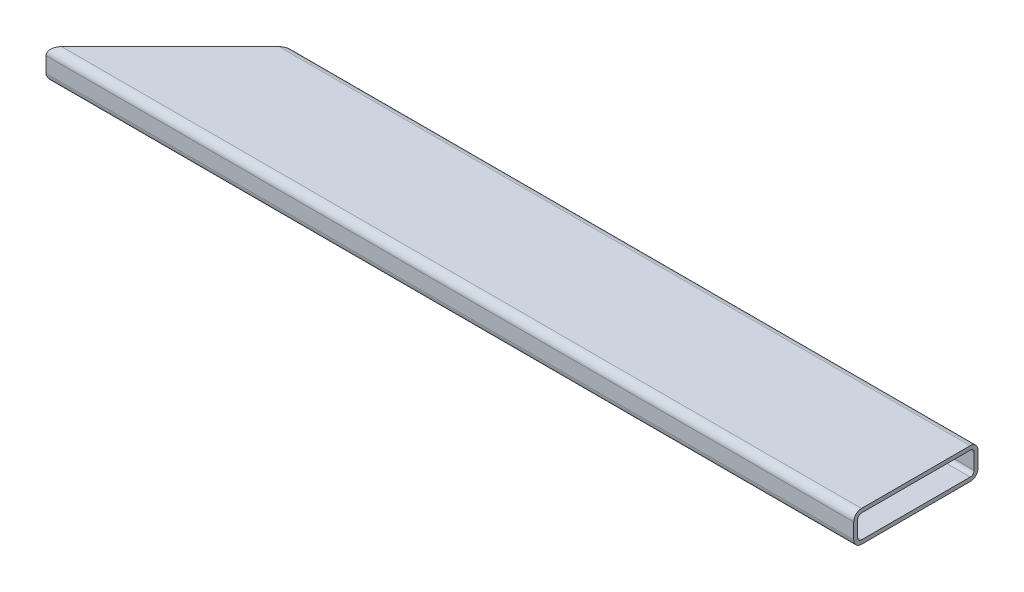
ISO-10303-21;
HEADER;
FILE_DESCRIPTION(('STEP AP214'),'2;1');
FILE_NAME('part.step','',(''),(''),'','','');
FILE_SCHEMA(('AUTOMOTIVE_DESIGN { 1 0 10303 214 1 1 1 1 }'));
ENDSEC;
DATA;
#1=APPLICATION_CONTEXT('core data for automotive mechanical design processes');
#2=APPLICATION_PROTOCOL_DEFINITION('international standard','automotive_design',2000,#1);
#3=PRODUCT_CONTEXT('',#1,'mechanical');
#4=PRODUCT('Part','Part','',(#3));
#5=PRODUCT_RELATED_PRODUCT_CATEGORY('part','',(#4));
#6=PRODUCT_DEFINITION_FORMATION('','',#4);
#7=PRODUCT_DEFINITION_CONTEXT('part definition',#1,'design');
#8=PRODUCT_DEFINITION('design','',#6,#7);
#9=PRODUCT_DEFINITION_SHAPE('','',#8);
#10=(LENGTH_UNIT() NAMED_UNIT(*) SI_UNIT(.MILLI.,.METRE.));
#11=(NAMED_UNIT(*) PLANE_ANGLE_UNIT() SI_UNIT($,.RADIAN.));
#12=(NAMED_UNIT(*) SI_UNIT($,.STERADIAN.) SOLID_ANGLE_UNIT());
#13=UNCERTAINTY_MEASURE_WITH_UNIT(LENGTH_MEASURE(1.E-05),#10,'distance_accuracy_value','');
#14=(GEOMETRIC_REPRESENTATION_CONTEXT(3) GLOBAL_UNCERTAINTY_ASSIGNED_CONTEXT((#13)) GLOBAL_UNIT_ASSIGNED_CONTEXT((#10,
#11,#12)) REPRESENTATION_CONTEXT('',''));
#15=CARTESIAN_POINT('',(0.,0.,0.));
#16=DIRECTION('',(0.,0.,1.));
#17=DIRECTION('',(1.,0.,0.));
#18=AXIS2_PLACEMENT_3D('',#15,#16,#17);
#19=CARTESIAN_POINT('',(660.4,0.,0.));
#20=DIRECTION('',(0.,0.,-1.));
#21=DIRECTION('',(-1.,0.,0.));
#22=AXIS2_PLACEMENT_3D('',#19,#20,#21);
#23=PLANE('',#22);
#24=DIRECTION('',(0.,-1.,0.));
#25=VECTOR('',#24,1.);
#26=CARTESIAN_POINT('',(0.,0.,0.));
#27=LINE('',#26,#25);
#28=CARTESIAN_POINT('',(0.,19.05,0.));
#29=VERTEX_POINT('',#28);
#30=CARTESIAN_POINT('',(0.,6.35,0.));
#31=VERTEX_POINT('',#30);
#32=EDGE_CURVE('E156',#29,#31,#27,.T.);
#33=ORIENTED_EDGE('',*,*,#32,.T.);
#34=DIRECTION('',(-1.,0.,0.));
#35=VECTOR('',#34,1.);
#36=CARTESIAN_POINT('',(660.4,6.35,0.));
#37=LINE('',#36,#35);
#38=CARTESIAN_POINT('',(660.4,6.35,0.));
#39=VERTEX_POINT('',#38);
#40=EDGE_CURVE('E46',#31,#39,#37,.F.);
#41=ORIENTED_EDGE('',*,*,#40,.T.);
#42=DIRECTION('',(0.,-1.,0.));
#43=VECTOR('',#42,1.);
#44=CARTESIAN_POINT('',(660.4,0.,0.));
#45=LINE('',#44,#43);
#46=CARTESIAN_POINT('',(660.4,19.05,0.));
#47=VERTEX_POINT('',#46);
#48=EDGE_CURVE('E188',#47,#39,#45,.T.);
#49=ORIENTED_EDGE('',*,*,#48,.F.);
#50=DIRECTION('',(-1.,0.,0.));
#51=VECTOR('',#50,1.);
#52=CARTESIAN_POINT('',(660.4,19.05,0.));
#53=LINE('',#52,#51);
#54=EDGE_CURVE('E178',#47,#29,#53,.T.);
#55=ORIENTED_EDGE('',*,*,#54,.T.);
#56=EDGE_LOOP('',(#33,#41,#49,#55));
#57=FACE_BOUND('',#56,.T.);
#58=ADVANCED_FACE('F38',(#57),#23,.F.);
#59=CARTESIAN_POINT('',(660.4,0.,0.));
#60=DIRECTION('',(0.,1.,0.));
#61=DIRECTION('',(0.,0.,1.));
#62=AXIS2_PLACEMENT_3D('',#59,#60,#61);
#63=PLANE('',#62);
#64=DIRECTION('',(-1.,0.,0.));
#65=VECTOR('',#64,1.);
#66=CARTESIAN_POINT('',(660.4,0.,-6.35));
#67=LINE('',#66,#65);
#68=CARTESIAN_POINT('',(660.4,0.,-6.35));
#69=VERTEX_POINT('',#68);
#70=CARTESIAN_POINT('',(6.35000000000008,0.,-6.35));
#71=VERTEX_POINT('',#70);
#72=EDGE_CURVE('E202',#69,#71,#67,.T.);
#73=ORIENTED_EDGE('',*,*,#72,.T.);
#74=DIRECTION('',(0.707106781186551,0.,-0.707106781186544));
#75=VECTOR('',#74,1.);
#76=CARTESIAN_POINT('',(0.,0.,0.));
#77=LINE('',#76,#75);
#78=CARTESIAN_POINT('',(95.250000000001,0.,-95.25));
#79=VERTEX_POINT('',#78);
#80=EDGE_CURVE('E172',#71,#79,#77,.T.);
#81=ORIENTED_EDGE('',*,*,#80,.T.);
#82=DIRECTION('',(-1.,0.,0.));
#83=VECTOR('',#82,1.);
#84=CARTESIAN_POINT('',(660.4,0.,-95.25));
#85=LINE('',#84,#83);
#86=CARTESIAN_POINT('',(660.4,0.,-95.25));
#87=VERTEX_POINT('',#86);
#88=EDGE_CURVE('E204',#79,#87,#85,.F.);
#89=ORIENTED_EDGE('',*,*,#88,.T.);
#90=DIRECTION('',(0.,0.,-1.));
#91=VECTOR('',#90,1.);
#92=CARTESIAN_POINT('',(660.4,0.,0.));
#93=LINE('',#92,#91);
#94=EDGE_CURVE('E197',#69,#87,#93,.T.);
#95=ORIENTED_EDGE('',*,*,#94,.F.);
#96=EDGE_LOOP('',(#73,#81,#89,#95));
#97=FACE_BOUND('',#96,.T.);
#98=ADVANCED_FACE('F284',(#97),#63,.F.);
#99=CARTESIAN_POINT('',(660.4,0.,-101.6));
#100=DIRECTION('',(0.,0.,1.));
#101=DIRECTION('',(1.,0.,0.));
#102=AXIS2_PLACEMENT_3D('',#99,#100,#101);
#103=PLANE('',#102);
#104=DIRECTION('',(-1.,0.,0.));
#105=VECTOR('',#104,1.);
#106=CARTESIAN_POINT('',(660.4,6.35,-101.6));
#107=LINE('',#106,#105);
#108=CARTESIAN_POINT('',(660.4,6.35,-101.6));
#109=VERTEX_POINT('',#108);
#110=CARTESIAN_POINT('',(101.600000000001,6.35,-101.6));
#111=VERTEX_POINT('',#110);
#112=EDGE_CURVE('E209',#109,#111,#107,.T.);
#113=ORIENTED_EDGE('',*,*,#112,.T.);
#114=DIRECTION('',(0.,1.,0.));
#115=VECTOR('',#114,1.);
#116=CARTESIAN_POINT('',(101.600000000001,0.,-101.6));
#117=LINE('',#116,#115);
#118=CARTESIAN_POINT('',(101.600000000001,19.05,-101.6));
#119=VERTEX_POINT('',#118);
#120=EDGE_CURVE('E278',#111,#119,#117,.T.);
#121=ORIENTED_EDGE('',*,*,#120,.T.);
#122=DIRECTION('',(-1.,0.,0.));
#123=VECTOR('',#122,1.);
#124=CARTESIAN_POINT('',(660.4,19.05,-101.6));
#125=LINE('',#124,#123);
#126=CARTESIAN_POINT('',(660.4,19.05,-101.6));
#127=VERTEX_POINT('',#126);
#128=EDGE_CURVE('E212',#119,#127,#125,.F.);
#129=ORIENTED_EDGE('',*,*,#128,.T.);
#130=DIRECTION('',(0.,1.,0.));
#131=VECTOR('',#130,1.);
#132=CARTESIAN_POINT('',(660.4,0.,-101.6));
#133=LINE('',#132,#131);
#134=EDGE_CURVE('E217',#109,#127,#133,.T.);
#135=ORIENTED_EDGE('',*,*,#134,.F.);
#136=EDGE_LOOP('',(#113,#121,#129,#135));
#137=FACE_BOUND('',#136,.T.);
#138=ADVANCED_FACE('F293',(#137),#103,.F.);
#139=CARTESIAN_POINT('',(660.4,25.4,0.));
#140=DIRECTION('',(0.,-1.,0.));
#141=DIRECTION('',(0.,0.,-1.));
#142=AXIS2_PLACEMENT_3D('',#139,#140,#141);
#143=PLANE('',#142);
#144=DIRECTION('',(-1.,0.,0.));
#145=VECTOR('',#144,1.);
#146=CARTESIAN_POINT('',(660.4,25.4,-95.25));
#147=LINE('',#146,#145);
#148=CARTESIAN_POINT('',(660.4,25.4,-95.25));
#149=VERTEX_POINT('',#148);
#150=CARTESIAN_POINT('',(95.250000000001,25.4,-95.25));
#151=VERTEX_POINT('',#150);
#152=EDGE_CURVE('E171',#149,#151,#147,.T.);
#153=ORIENTED_EDGE('',*,*,#152,.T.);
#154=DIRECTION('',(0.707106781186551,0.,-0.707106781186544));
#155=VECTOR('',#154,1.);
#156=CARTESIAN_POINT('',(0.,25.4,0.));
#157=LINE('',#156,#155);
#158=CARTESIAN_POINT('',(6.35000000000008,25.4,-6.35));
#159=VERTEX_POINT('',#158);
#160=EDGE_CURVE('E153',#159,#151,#157,.T.);
#161=ORIENTED_EDGE('',*,*,#160,.F.);
#162=DIRECTION('',(-1.,0.,0.));
#163=VECTOR('',#162,1.);
#164=CARTESIAN_POINT('',(660.4,25.4,-6.35));
#165=LINE('',#164,#163);
#166=CARTESIAN_POINT('',(660.4,25.4,-6.35));
#167=VERTEX_POINT('',#166);
#168=EDGE_CURVE('E168',#159,#167,#165,.F.);
#169=ORIENTED_EDGE('',*,*,#168,.T.);
#170=DIRECTION('',(0.,0.,1.));
#171=VECTOR('',#170,1.);
#172=CARTESIAN_POINT('',(660.4,25.4,0.));
#173=LINE('',#172,#171);
#174=EDGE_CURVE('E214',#149,#167,#173,.T.);
#175=ORIENTED_EDGE('',*,*,#174,.F.);
#176=EDGE_LOOP('',(#153,#161,#169,#175));
#177=FACE_BOUND('',#176,.T.);
#178=ADVANCED_FACE('F166',(#177),#143,.F.);
#179=CARTESIAN_POINT('',(660.4,0.,0.));
#180=DIRECTION('',(-1.,0.,0.));
#181=DIRECTION('',(0.,0.,1.));
#182=AXIS2_PLACEMENT_3D('',#179,#180,#181);
#183=PLANE('',#182);
#184=DIRECTION('',(0.,0.,-1.));
#185=VECTOR('',#184,1.);
#186=CARTESIAN_POINT('',(660.4,3.175,0.));
#187=LINE('',#186,#185);
#188=CARTESIAN_POINT('',(660.4,3.175,-6.35));
#189=VERTEX_POINT('',#188);
#190=CARTESIAN_POINT('',(660.4,3.175,-95.25));
#191=VERTEX_POINT('',#190);
#192=EDGE_CURVE('E235',#189,#191,#187,.T.);
#193=ORIENTED_EDGE('',*,*,#192,.F.);
#194=CARTESIAN_POINT('',(660.4,6.35,-6.35));
#195=DIRECTION('',(-1.,0.,0.));
#196=DIRECTION('',(0.,0.,1.));
#197=AXIS2_PLACEMENT_3D('',#194,#195,#196);
#198=CIRCLE('',#197,3.175);
#199=CARTESIAN_POINT('',(660.4,6.35,-3.175));
#200=VERTEX_POINT('',#199);
#201=EDGE_CURVE('E223',#200,#189,#198,.F.);
#202=ORIENTED_EDGE('',*,*,#201,.F.);
#203=DIRECTION('',(0.,-1.,0.));
#204=VECTOR('',#203,1.);
#205=CARTESIAN_POINT('',(660.4,0.,-3.175));
#206=LINE('',#205,#204);
#207=CARTESIAN_POINT('',(660.4,19.05,-3.175));
#208=VERTEX_POINT('',#207);
#209=EDGE_CURVE('E240',#208,#200,#206,.T.);
#210=ORIENTED_EDGE('',*,*,#209,.F.);
#211=CARTESIAN_POINT('',(660.4,19.05,-6.35));
#212=DIRECTION('',(-1.,0.,0.));
#213=DIRECTION('',(0.,0.,1.));
#214=AXIS2_PLACEMENT_3D('',#211,#212,#213);
#215=CIRCLE('',#214,3.175);
#216=CARTESIAN_POINT('',(660.4,22.225,-6.35));
#217=VERTEX_POINT('',#216);
#218=EDGE_CURVE('E221',#217,#208,#215,.F.);
#219=ORIENTED_EDGE('',*,*,#218,.F.);
#220=DIRECTION('',(0.,0.,1.));
#221=VECTOR('',#220,1.);
#222=CARTESIAN_POINT('',(660.4,22.225,0.));
#223=LINE('',#222,#221);
#224=CARTESIAN_POINT('',(660.4,22.225,-95.25));
#225=VERTEX_POINT('',#224);
#226=EDGE_CURVE('E225',#225,#217,#223,.T.);
#227=ORIENTED_EDGE('',*,*,#226,.F.);
#228=CARTESIAN_POINT('',(660.4,19.05,-95.25));
#229=DIRECTION('',(-1.,0.,0.));
#230=DIRECTION('',(0.,0.,1.));
#231=AXIS2_PLACEMENT_3D('',#228,#229,#230);
#232=CIRCLE('',#231,3.175);
#233=CARTESIAN_POINT('',(660.4,19.05,-98.425));
#234=VERTEX_POINT('',#233);
#235=EDGE_CURVE('E230',#234,#225,#232,.F.);
#236=ORIENTED_EDGE('',*,*,#235,.F.);
#237=DIRECTION('',(0.,1.,0.));
#238=VECTOR('',#237,1.);
#239=CARTESIAN_POINT('',(660.4,0.,-98.425));
#240=LINE('',#239,#238);
#241=CARTESIAN_POINT('',(660.4,6.35,-98.425));
#242=VERTEX_POINT('',#241);
#243=EDGE_CURVE('E229',#242,#234,#240,.T.);
#244=ORIENTED_EDGE('',*,*,#243,.F.);
#245=CARTESIAN_POINT('',(660.4,6.35,-95.25));
#246=DIRECTION('',(-1.,0.,0.));
#247=DIRECTION('',(0.,0.,1.));
#248=AXIS2_PLACEMENT_3D('',#245,#246,#247);
#249=CIRCLE('',#248,3.175);
#250=EDGE_CURVE('E232',#191,#242,#249,.F.);
#251=ORIENTED_EDGE('',*,*,#250,.F.);
#252=EDGE_LOOP('',(#193,#202,#210,#219,#227,#236,#244,#251));
#253=FACE_BOUND('',#252,.T.);
#254=ORIENTED_EDGE('',*,*,#94,.T.);
#255=CARTESIAN_POINT('',(660.4,6.35,-95.25));
#256=DIRECTION('',(-1.,0.,0.));
#257=DIRECTION('',(0.,0.,1.));
#258=AXIS2_PLACEMENT_3D('',#255,#256,#257);
#259=CIRCLE('',#258,6.35);
#260=EDGE_CURVE('E176',#87,#109,#259,.F.);
#261=ORIENTED_EDGE('',*,*,#260,.T.);
#262=ORIENTED_EDGE('',*,*,#134,.T.);
#263=CARTESIAN_POINT('',(660.4,19.05,-95.25));
#264=DIRECTION('',(-1.,0.,0.));
#265=DIRECTION('',(0.,0.,1.));
#266=AXIS2_PLACEMENT_3D('',#263,#264,#265);
#267=CIRCLE('',#266,6.35);
#268=EDGE_CURVE('E180',#127,#149,#267,.F.);
#269=ORIENTED_EDGE('',*,*,#268,.T.);
#270=ORIENTED_EDGE('',*,*,#174,.T.);
#271=CARTESIAN_POINT('',(660.4,19.05,-6.35));
#272=DIRECTION('',(-1.,0.,0.));
#273=DIRECTION('',(0.,0.,1.));
#274=AXIS2_PLACEMENT_3D('',#271,#272,#273);
#275=CIRCLE('',#274,6.35);
#276=EDGE_CURVE('E175',#167,#47,#275,.F.);
#277=ORIENTED_EDGE('',*,*,#276,.T.);
#278=ORIENTED_EDGE('',*,*,#48,.T.);
#279=CARTESIAN_POINT('',(660.4,6.35,-6.35));
#280=DIRECTION('',(-1.,0.,0.));
#281=DIRECTION('',(0.,0.,1.));
#282=AXIS2_PLACEMENT_3D('',#279,#280,#281);
#283=CIRCLE('',#282,6.35);
#284=EDGE_CURVE('E195',#39,#69,#283,.F.);
#285=ORIENTED_EDGE('',*,*,#284,.T.);
#286=EDGE_LOOP('',(#254,#261,#262,#269,#270,#277,#278,#285));
#287=FACE_BOUND('',#286,.T.);
#288=ADVANCED_FACE('F194',(#253,#287),#183,.F.);
#289=CARTESIAN_POINT('',(660.4,6.35,-95.25));
#290=DIRECTION('',(-1.,0.,0.));
#291=DIRECTION('',(0.,0.,1.));
#292=AXIS2_PLACEMENT_3D('',#289,#290,#291);
#293=CYLINDRICAL_SURFACE('',#292,6.35);
#294=CARTESIAN_POINT('',(95.2500000000011,6.35,-95.25));
#295=DIRECTION('',(0.707106781186544,0.,0.707106781186551));
#296=DIRECTION('',(-0.707106781186551,0.,0.707106781186544));
#297=AXIS2_PLACEMENT_3D('',#294,#295,#296);
#298=ELLIPSE('',#297,8.9802561210692,6.35);
#299=EDGE_CURVE('E243',#111,#79,#298,.F.);
#300=ORIENTED_EDGE('',*,*,#299,.F.);
#301=ORIENTED_EDGE('',*,*,#112,.F.);
#302=ORIENTED_EDGE('',*,*,#260,.F.);
#303=ORIENTED_EDGE('',*,*,#88,.F.);
#304=EDGE_LOOP('',(#300,#301,#302,#303));
#305=FACE_BOUND('',#304,.T.);
#306=ADVANCED_FACE('F288',(#305),#293,.T.);
#307=CARTESIAN_POINT('',(660.4,19.05,-95.25));
#308=DIRECTION('',(-1.,0.,0.));
#309=DIRECTION('',(0.,0.,1.));
#310=AXIS2_PLACEMENT_3D('',#307,#308,#309);
#311=CYLINDRICAL_SURFACE('',#310,6.35);
#312=CARTESIAN_POINT('',(95.2500000000011,19.05,-95.25));
#313=DIRECTION('',(0.707106781186544,0.,0.707106781186551));
#314=DIRECTION('',(-0.707106781186551,0.,0.707106781186544));
#315=AXIS2_PLACEMENT_3D('',#312,#313,#314);
#316=ELLIPSE('',#315,8.9802561210692,6.35);
#317=EDGE_CURVE('E261',#151,#119,#316,.F.);
#318=ORIENTED_EDGE('',*,*,#317,.F.);
#319=ORIENTED_EDGE('',*,*,#152,.F.);
#320=ORIENTED_EDGE('',*,*,#268,.F.);
#321=ORIENTED_EDGE('',*,*,#128,.F.);
#322=EDGE_LOOP('',(#318,#319,#320,#321));
#323=FACE_BOUND('',#322,.T.);
#324=ADVANCED_FACE('F296',(#323),#311,.T.);
#325=CARTESIAN_POINT('',(660.4,6.35,-6.35));
#326=DIRECTION('',(-1.,0.,0.));
#327=DIRECTION('',(0.,0.,1.));
#328=AXIS2_PLACEMENT_3D('',#325,#326,#327);
#329=CYLINDRICAL_SURFACE('',#328,6.35);
#330=CARTESIAN_POINT('',(6.35000000000008,6.35,-6.35));
#331=DIRECTION('',(0.707106781186544,0.,0.707106781186551));
#332=DIRECTION('',(-0.707106781186551,0.,0.707106781186544));
#333=AXIS2_PLACEMENT_3D('',#330,#331,#332);
#334=ELLIPSE('',#333,8.9802561210692,6.35);
#335=EDGE_CURVE('E161',#71,#31,#334,.F.);
#336=ORIENTED_EDGE('',*,*,#335,.F.);
#337=ORIENTED_EDGE('',*,*,#72,.F.);
#338=ORIENTED_EDGE('',*,*,#284,.F.);
#339=ORIENTED_EDGE('',*,*,#40,.F.);
#340=EDGE_LOOP('',(#336,#337,#338,#339));
#341=FACE_BOUND('',#340,.T.);
#342=ADVANCED_FACE('F200',(#341),#329,.T.);
#343=CARTESIAN_POINT('',(660.4,19.05,-6.35));
#344=DIRECTION('',(-1.,0.,0.));
#345=DIRECTION('',(0.,0.,1.));
#346=AXIS2_PLACEMENT_3D('',#343,#344,#345);
#347=CYLINDRICAL_SURFACE('',#346,6.35);
#348=CARTESIAN_POINT('',(6.35000000000008,19.05,-6.35));
#349=DIRECTION('',(0.707106781186544,0.,0.707106781186551));
#350=DIRECTION('',(-0.707106781186551,0.,0.707106781186544));
#351=AXIS2_PLACEMENT_3D('',#348,#349,#350);
#352=ELLIPSE('',#351,8.9802561210692,6.35);
#353=EDGE_CURVE('E150',#29,#159,#352,.F.);
#354=ORIENTED_EDGE('',*,*,#353,.F.);
#355=ORIENTED_EDGE('',*,*,#54,.F.);
#356=ORIENTED_EDGE('',*,*,#276,.F.);
#357=ORIENTED_EDGE('',*,*,#168,.F.);
#358=EDGE_LOOP('',(#354,#355,#356,#357));
#359=FACE_BOUND('',#358,.T.);
#360=ADVANCED_FACE('F40',(#359),#347,.T.);
#361=CARTESIAN_POINT('',(660.4,0.,-3.175));
#362=DIRECTION('',(0.,0.,-1.));
#363=DIRECTION('',(-1.,0.,0.));
#364=AXIS2_PLACEMENT_3D('',#361,#362,#363);
#365=PLANE('',#364);
#366=DIRECTION('',(0.,-1.,0.));
#367=VECTOR('',#366,1.);
#368=CARTESIAN_POINT('',(3.17500000000004,0.,-3.175));
#369=LINE('',#368,#367);
#370=CARTESIAN_POINT('',(3.17500000000004,19.05,-3.175));
#371=VERTEX_POINT('',#370);
#372=CARTESIAN_POINT('',(3.17500000000004,6.35,-3.175));
#373=VERTEX_POINT('',#372);
#374=EDGE_CURVE('E275',#371,#373,#369,.T.);
#375=ORIENTED_EDGE('',*,*,#374,.F.);
#376=DIRECTION('',(-1.,0.,0.));
#377=VECTOR('',#376,1.);
#378=CARTESIAN_POINT('',(660.4,19.05,-3.175));
#379=LINE('',#378,#377);
#380=EDGE_CURVE('E248',#208,#371,#379,.T.);
#381=ORIENTED_EDGE('',*,*,#380,.F.);
#382=ORIENTED_EDGE('',*,*,#209,.T.);
#383=DIRECTION('',(-1.,0.,0.));
#384=VECTOR('',#383,1.);
#385=CARTESIAN_POINT('',(660.4,6.35,-3.175));
#386=LINE('',#385,#384);
#387=EDGE_CURVE('E60',#373,#200,#386,.F.);
#388=ORIENTED_EDGE('',*,*,#387,.F.);
#389=EDGE_LOOP('',(#375,#381,#382,#388));
#390=FACE_BOUND('',#389,.T.);
#391=ADVANCED_FACE('F344',(#390),#365,.T.);
#392=CARTESIAN_POINT('',(660.4,3.175,0.));
#393=DIRECTION('',(0.,1.,0.));
#394=DIRECTION('',(0.,0.,1.));
#395=AXIS2_PLACEMENT_3D('',#392,#393,#394);
#396=PLANE('',#395);
#397=DIRECTION('',(0.707106781186551,0.,-0.707106781186544));
#398=VECTOR('',#397,1.);
#399=CARTESIAN_POINT('',(330.200000000003,3.175,-330.2));
#400=LINE('',#399,#398);
#401=CARTESIAN_POINT('',(6.35000000000008,3.175,-6.35));
#402=VERTEX_POINT('',#401);
#403=CARTESIAN_POINT('',(95.2500000000009,3.175,-95.25));
#404=VERTEX_POINT('',#403);
#405=EDGE_CURVE('E266',#402,#404,#400,.T.);
#406=ORIENTED_EDGE('',*,*,#405,.F.);
#407=DIRECTION('',(1.,0.,0.));
#408=VECTOR('',#407,1.);
#409=CARTESIAN_POINT('',(660.4,3.175,-6.35));
#410=LINE('',#409,#408);
#411=EDGE_CURVE('E253',#189,#402,#410,.F.);
#412=ORIENTED_EDGE('',*,*,#411,.F.);
#413=ORIENTED_EDGE('',*,*,#192,.T.);
#414=DIRECTION('',(1.,0.,0.));
#415=VECTOR('',#414,1.);
#416=CARTESIAN_POINT('',(660.4,3.175,-95.25));
#417=LINE('',#416,#415);
#418=EDGE_CURVE('E224',#404,#191,#417,.T.);
#419=ORIENTED_EDGE('',*,*,#418,.F.);
#420=EDGE_LOOP('',(#406,#412,#413,#419));
#421=FACE_BOUND('',#420,.T.);
#422=ADVANCED_FACE('F340',(#421),#396,.T.);
#423=CARTESIAN_POINT('',(660.4,0.,-98.425));
#424=DIRECTION('',(0.,0.,1.));
#425=DIRECTION('',(1.,0.,0.));
#426=AXIS2_PLACEMENT_3D('',#423,#424,#425);
#427=PLANE('',#426);
#428=DIRECTION('',(0.,1.,0.));
#429=VECTOR('',#428,1.);
#430=CARTESIAN_POINT('',(98.4250000000011,0.,-98.425));
#431=LINE('',#430,#429);
#432=CARTESIAN_POINT('',(98.4250000000011,6.35,-98.425));
#433=VERTEX_POINT('',#432);
#434=CARTESIAN_POINT('',(98.4250000000011,19.05,-98.425));
#435=VERTEX_POINT('',#434);
#436=EDGE_CURVE('E268',#433,#435,#431,.T.);
#437=ORIENTED_EDGE('',*,*,#436,.F.);
#438=DIRECTION('',(1.,0.,0.));
#439=VECTOR('',#438,1.);
#440=CARTESIAN_POINT('',(660.4,6.35,-98.425));
#441=LINE('',#440,#439);
#442=EDGE_CURVE('E250',#242,#433,#441,.F.);
#443=ORIENTED_EDGE('',*,*,#442,.F.);
#444=ORIENTED_EDGE('',*,*,#243,.T.);
#445=DIRECTION('',(1.,0.,0.));
#446=VECTOR('',#445,1.);
#447=CARTESIAN_POINT('',(660.4,19.05,-98.425));
#448=LINE('',#447,#446);
#449=EDGE_CURVE('E228',#435,#234,#448,.T.);
#450=ORIENTED_EDGE('',*,*,#449,.F.);
#451=EDGE_LOOP('',(#437,#443,#444,#450));
#452=FACE_BOUND('',#451,.T.);
#453=ADVANCED_FACE('F336',(#452),#427,.T.);
#454=CARTESIAN_POINT('',(660.4,22.225,0.));
#455=DIRECTION('',(0.,-1.,0.));
#456=DIRECTION('',(0.,0.,-1.));
#457=AXIS2_PLACEMENT_3D('',#454,#455,#456);
#458=PLANE('',#457);
#459=DIRECTION('',(-0.707106781186551,0.,0.707106781186544));
#460=VECTOR('',#459,1.);
#461=CARTESIAN_POINT('',(330.200000000003,22.225,-330.2));
#462=LINE('',#461,#460);
#463=CARTESIAN_POINT('',(95.2500000000009,22.225,-95.25));
#464=VERTEX_POINT('',#463);
#465=CARTESIAN_POINT('',(6.35000000000008,22.225,-6.35));
#466=VERTEX_POINT('',#465);
#467=EDGE_CURVE('E53',#464,#466,#462,.T.);
#468=ORIENTED_EDGE('',*,*,#467,.F.);
#469=DIRECTION('',(1.,0.,0.));
#470=VECTOR('',#469,1.);
#471=CARTESIAN_POINT('',(660.4,22.225,-95.25));
#472=LINE('',#471,#470);
#473=EDGE_CURVE('E245',#225,#464,#472,.F.);
#474=ORIENTED_EDGE('',*,*,#473,.F.);
#475=ORIENTED_EDGE('',*,*,#226,.T.);
#476=DIRECTION('',(1.,0.,0.));
#477=VECTOR('',#476,1.);
#478=CARTESIAN_POINT('',(660.4,22.225,-6.35));
#479=LINE('',#478,#477);
#480=EDGE_CURVE('E237',#466,#217,#479,.T.);
#481=ORIENTED_EDGE('',*,*,#480,.F.);
#482=EDGE_LOOP('',(#468,#474,#475,#481));
#483=FACE_BOUND('',#482,.T.);
#484=ADVANCED_FACE('F332',(#483),#458,.T.);
#485=CARTESIAN_POINT('',(660.4,6.35,-95.25));
#486=DIRECTION('',(-1.,0.,0.));
#487=DIRECTION('',(0.,0.,1.));
#488=AXIS2_PLACEMENT_3D('',#485,#486,#487);
#489=CYLINDRICAL_SURFACE('',#488,3.175);
#490=ORIENTED_EDGE('',*,*,#442,.T.);
#491=CARTESIAN_POINT('',(95.2500000000011,6.35,-95.25));
#492=DIRECTION('',(0.707106781186544,0.,0.707106781186551));
#493=DIRECTION('',(-0.707106781186551,0.,0.707106781186544));
#494=AXIS2_PLACEMENT_3D('',#491,#492,#493);
#495=ELLIPSE('',#494,4.4901280605346,3.175);
#496=EDGE_CURVE('E162',#433,#404,#495,.F.);
#497=ORIENTED_EDGE('',*,*,#496,.T.);
#498=ORIENTED_EDGE('',*,*,#418,.T.);
#499=ORIENTED_EDGE('',*,*,#250,.T.);
#500=EDGE_LOOP('',(#490,#497,#498,#499));
#501=FACE_BOUND('',#500,.T.);
#502=ADVANCED_FACE('F328',(#501),#489,.F.);
#503=CARTESIAN_POINT('',(660.4,19.05,-95.25));
#504=DIRECTION('',(-1.,0.,0.));
#505=DIRECTION('',(0.,0.,1.));
#506=AXIS2_PLACEMENT_3D('',#503,#504,#505);
#507=CYLINDRICAL_SURFACE('',#506,3.175);
#508=ORIENTED_EDGE('',*,*,#473,.T.);
#509=CARTESIAN_POINT('',(95.2500000000011,19.05,-95.25));
#510=DIRECTION('',(0.707106781186544,0.,0.707106781186551));
#511=DIRECTION('',(-0.707106781186551,0.,0.707106781186544));
#512=AXIS2_PLACEMENT_3D('',#509,#510,#511);
#513=ELLIPSE('',#512,4.4901280605346,3.175);
#514=EDGE_CURVE('E270',#464,#435,#513,.F.);
#515=ORIENTED_EDGE('',*,*,#514,.T.);
#516=ORIENTED_EDGE('',*,*,#449,.T.);
#517=ORIENTED_EDGE('',*,*,#235,.T.);
#518=EDGE_LOOP('',(#508,#515,#516,#517));
#519=FACE_BOUND('',#518,.T.);
#520=ADVANCED_FACE('F325',(#519),#507,.F.);
#521=CARTESIAN_POINT('',(660.4,6.35,-6.35));
#522=DIRECTION('',(-1.,0.,0.));
#523=DIRECTION('',(0.,0.,1.));
#524=AXIS2_PLACEMENT_3D('',#521,#522,#523);
#525=CYLINDRICAL_SURFACE('',#524,3.175);
#526=ORIENTED_EDGE('',*,*,#411,.T.);
#527=CARTESIAN_POINT('',(6.35000000000008,6.35,-6.35));
#528=DIRECTION('',(0.707106781186544,0.,0.707106781186551));
#529=DIRECTION('',(-0.707106781186551,0.,0.707106781186544));
#530=AXIS2_PLACEMENT_3D('',#527,#528,#529);
#531=ELLIPSE('',#530,4.4901280605346,3.175);
#532=EDGE_CURVE('E273',#402,#373,#531,.F.);
#533=ORIENTED_EDGE('',*,*,#532,.T.);
#534=ORIENTED_EDGE('',*,*,#387,.T.);
#535=ORIENTED_EDGE('',*,*,#201,.T.);
#536=EDGE_LOOP('',(#526,#533,#534,#535));
#537=FACE_BOUND('',#536,.T.);
#538=ADVANCED_FACE('F321',(#537),#525,.F.);
#539=CARTESIAN_POINT('',(660.4,19.05,-6.35));
#540=DIRECTION('',(-1.,0.,0.));
#541=DIRECTION('',(0.,0.,1.));
#542=AXIS2_PLACEMENT_3D('',#539,#540,#541);
#543=CYLINDRICAL_SURFACE('',#542,3.175);
#544=ORIENTED_EDGE('',*,*,#380,.T.);
#545=CARTESIAN_POINT('',(6.35000000000008,19.05,-6.35));
#546=DIRECTION('',(0.707106781186544,0.,0.707106781186551));
#547=DIRECTION('',(-0.707106781186551,0.,0.707106781186544));
#548=AXIS2_PLACEMENT_3D('',#545,#546,#547);
#549=ELLIPSE('',#548,4.4901280605346,3.175);
#550=EDGE_CURVE('E11',#371,#466,#549,.F.);
#551=ORIENTED_EDGE('',*,*,#550,.T.);
#552=ORIENTED_EDGE('',*,*,#480,.T.);
#553=ORIENTED_EDGE('',*,*,#218,.T.);
#554=EDGE_LOOP('',(#544,#551,#552,#553));
#555=FACE_BOUND('',#554,.T.);
#556=ADVANCED_FACE('F318',(#555),#543,.F.);
#557=CARTESIAN_POINT('',(0.,0.,0.));
#558=DIRECTION('',(0.707106781186544,0.,0.707106781186551));
#559=DIRECTION('',(0.707106781186551,0.,-0.707106781186544));
#560=AXIS2_PLACEMENT_3D('',#557,#558,#559);
#561=PLANE('',#560);
#562=ORIENTED_EDGE('',*,*,#299,.T.);
#563=ORIENTED_EDGE('',*,*,#80,.F.);
#564=ORIENTED_EDGE('',*,*,#335,.T.);
#565=ORIENTED_EDGE('',*,*,#32,.F.);
#566=ORIENTED_EDGE('',*,*,#353,.T.);
#567=ORIENTED_EDGE('',*,*,#160,.T.);
#568=ORIENTED_EDGE('',*,*,#317,.T.);
#569=ORIENTED_EDGE('',*,*,#120,.F.);
#570=EDGE_LOOP('',(#562,#563,#564,#565,#566,#567,#568,#569));
#571=FACE_BOUND('',#570,.T.);
#572=ORIENTED_EDGE('',*,*,#436,.T.);
#573=ORIENTED_EDGE('',*,*,#514,.F.);
#574=ORIENTED_EDGE('',*,*,#467,.T.);
#575=ORIENTED_EDGE('',*,*,#550,.F.);
#576=ORIENTED_EDGE('',*,*,#374,.T.);
#577=ORIENTED_EDGE('',*,*,#532,.F.);
#578=ORIENTED_EDGE('',*,*,#405,.T.);
#579=ORIENTED_EDGE('',*,*,#496,.F.);
#580=EDGE_LOOP('',(#572,#573,#574,#575,#576,#577,#578,#579));
#581=FACE_BOUND('',#580,.T.);
#582=ADVANCED_FACE('F152',(#571,#581),#561,.F.);
#583=CLOSED_SHELL('',(#58,#98,#138,#178,#288,#306,#324,#342,#360,#391,#422,#453,#484,#502,#520,
#538,#556,#582));
#584=MANIFOLD_SOLID_BREP('B2',#583);
#585=ADVANCED_BREP_SHAPE_REPRESENTATION('',(#18,#584),#14);
#586=SHAPE_DEFINITION_REPRESENTATION(#9,#585);
ENDSEC;
END-ISO-10303-21;
